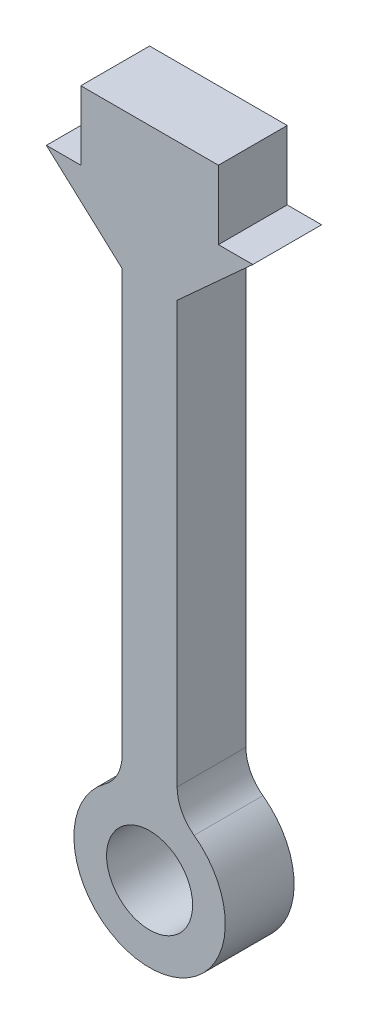
ISO-10303-21;
HEADER;
FILE_DESCRIPTION(('STEP AP214'),'2;1');
FILE_NAME('part.step','',(''),(''),'','','');
FILE_SCHEMA(('AUTOMOTIVE_DESIGN { 1 0 10303 214 1 1 1 1 }'));
ENDSEC;
DATA;
#1=APPLICATION_CONTEXT('core data for automotive mechanical design processes');
#2=APPLICATION_PROTOCOL_DEFINITION('international standard','automotive_design',2000,#1);
#3=PRODUCT_CONTEXT('',#1,'mechanical');
#4=PRODUCT('Part','Part','',(#3));
#5=PRODUCT_RELATED_PRODUCT_CATEGORY('part','',(#4));
#6=PRODUCT_DEFINITION_FORMATION('','',#4);
#7=PRODUCT_DEFINITION_CONTEXT('part definition',#1,'design');
#8=PRODUCT_DEFINITION('design','',#6,#7);
#9=PRODUCT_DEFINITION_SHAPE('','',#8);
#10=(LENGTH_UNIT() NAMED_UNIT(*) SI_UNIT(.MILLI.,.METRE.));
#11=(NAMED_UNIT(*) PLANE_ANGLE_UNIT() SI_UNIT($,.RADIAN.));
#12=(NAMED_UNIT(*) SI_UNIT($,.STERADIAN.) SOLID_ANGLE_UNIT());
#13=UNCERTAINTY_MEASURE_WITH_UNIT(LENGTH_MEASURE(1.E-05),#10,'distance_accuracy_value','');
#14=(GEOMETRIC_REPRESENTATION_CONTEXT(3) GLOBAL_UNCERTAINTY_ASSIGNED_CONTEXT((#13)) GLOBAL_UNIT_ASSIGNED_CONTEXT((#10,
#11,#12)) REPRESENTATION_CONTEXT('',''));
#15=CARTESIAN_POINT('',(0.,0.,0.));
#16=DIRECTION('',(0.,0.,1.));
#17=DIRECTION('',(1.,0.,0.));
#18=AXIS2_PLACEMENT_3D('',#15,#16,#17);
#19=CARTESIAN_POINT('',(0.598395721925135,0.,2.));
#20=DIRECTION('',(1.,0.,0.));
#21=DIRECTION('',(0.,1.,0.));
#22=AXIS2_PLACEMENT_3D('',#19,#20,#21);
#23=PLANE('',#22);
#24=DIRECTION('',(0.,-1.,0.));
#25=VECTOR('',#24,1.);
#26=CARTESIAN_POINT('',(0.598395721925135,0.,0.));
#27=LINE('',#26,#25);
#28=CARTESIAN_POINT('',(0.598395721925135,-3.37226432808586,0.));
#29=VERTEX_POINT('',#28);
#30=CARTESIAN_POINT('',(0.598395721925137,-15.6227189111124,0.));
#31=VERTEX_POINT('',#30);
#32=EDGE_CURVE('E172',#29,#31,#27,.T.);
#33=ORIENTED_EDGE('',*,*,#32,.T.);
#34=DIRECTION('',(0.,0.,1.));
#35=VECTOR('',#34,1.);
#36=CARTESIAN_POINT('',(0.598395721925137,-15.6227189111124,2.));
#37=LINE('',#36,#35);
#38=CARTESIAN_POINT('',(0.598395721925137,-15.6227189111124,2.));
#39=VERTEX_POINT('',#38);
#40=EDGE_CURVE('E214',#31,#39,#37,.T.);
#41=ORIENTED_EDGE('',*,*,#40,.T.);
#42=DIRECTION('',(0.,-1.,0.));
#43=VECTOR('',#42,1.);
#44=CARTESIAN_POINT('',(0.598395721925135,0.,2.));
#45=LINE('',#44,#43);
#46=CARTESIAN_POINT('',(0.598395721925135,-3.37226432808586,2.));
#47=VERTEX_POINT('',#46);
#48=EDGE_CURVE('E152',#47,#39,#45,.T.);
#49=ORIENTED_EDGE('',*,*,#48,.F.);
#50=DIRECTION('',(0.,0.,-1.));
#51=VECTOR('',#50,1.);
#52=CARTESIAN_POINT('',(0.598395721925135,-3.37226432808586,2.));
#53=LINE('',#52,#51);
#54=EDGE_CURVE('E168',#47,#29,#53,.T.);
#55=ORIENTED_EDGE('',*,*,#54,.T.);
#56=EDGE_LOOP('',(#33,#41,#49,#55));
#57=FACE_BOUND('',#56,.T.);
#58=ADVANCED_FACE('F41',(#57),#23,.F.);
#59=CARTESIAN_POINT('',(1.39839572192514,-18.3722643280859,2.));
#60=DIRECTION('',(0.,0.,-1.));
#61=DIRECTION('',(-1.,0.,0.));
#62=AXIS2_PLACEMENT_3D('',#59,#60,#61);
#63=CYLINDRICAL_SURFACE('',#62,2.2);
#64=CARTESIAN_POINT('',(1.39839572192514,-18.3722643280859,2.));
#65=DIRECTION('',(0.,0.,1.));
#66=DIRECTION('',(1.,0.,0.));
#67=AXIS2_PLACEMENT_3D('',#64,#65,#66);
#68=CIRCLE('',#67,2.2);
#69=CARTESIAN_POINT('',(0.104278074866312,-16.5931467053383,2.));
#70=VERTEX_POINT('',#69);
#71=CARTESIAN_POINT('',(2.69251336898396,-16.5931467053383,2.));
#72=VERTEX_POINT('',#71);
#73=EDGE_CURVE('E150',#70,#72,#68,.T.);
#74=ORIENTED_EDGE('',*,*,#73,.F.);
#75=DIRECTION('',(0.,0.,-1.));
#76=VECTOR('',#75,1.);
#77=CARTESIAN_POINT('',(0.104278074866313,-16.5931467053383,2.));
#78=LINE('',#77,#76);
#79=CARTESIAN_POINT('',(0.104278074866312,-16.5931467053383,0.));
#80=VERTEX_POINT('',#79);
#81=EDGE_CURVE('E211',#70,#80,#78,.T.);
#82=ORIENTED_EDGE('',*,*,#81,.T.);
#83=CARTESIAN_POINT('',(1.39839572192514,-18.3722643280859,0.));
#84=DIRECTION('',(0.,0.,1.));
#85=DIRECTION('',(1.,0.,0.));
#86=AXIS2_PLACEMENT_3D('',#83,#84,#85);
#87=CIRCLE('',#86,2.2);
#88=CARTESIAN_POINT('',(2.69251336898396,-16.5931467053383,0.));
#89=VERTEX_POINT('',#88);
#90=EDGE_CURVE('E175',#80,#89,#87,.T.);
#91=ORIENTED_EDGE('',*,*,#90,.T.);
#92=DIRECTION('',(0.,0.,-1.));
#93=VECTOR('',#92,1.);
#94=CARTESIAN_POINT('',(2.69251336898396,-16.5931467053383,2.));
#95=LINE('',#94,#93);
#96=EDGE_CURVE('E138',#89,#72,#95,.F.);
#97=ORIENTED_EDGE('',*,*,#96,.T.);
#98=EDGE_LOOP('',(#74,#82,#91,#97));
#99=FACE_BOUND('',#98,.T.);
#100=ADVANCED_FACE('F227',(#99),#63,.T.);
#101=CARTESIAN_POINT('',(2.19839572192513,0.,2.));
#102=DIRECTION('',(1.,0.,0.));
#103=DIRECTION('',(0.,1.,0.));
#104=AXIS2_PLACEMENT_3D('',#101,#102,#103);
#105=PLANE('',#104);
#106=DIRECTION('',(0.,-1.,0.));
#107=VECTOR('',#106,1.);
#108=CARTESIAN_POINT('',(2.19839572192513,0.,2.));
#109=LINE('',#108,#107);
#110=CARTESIAN_POINT('',(2.19839572192513,-3.37226432808586,2.));
#111=VERTEX_POINT('',#110);
#112=CARTESIAN_POINT('',(2.19839572192514,-15.6227189111124,2.));
#113=VERTEX_POINT('',#112);
#114=EDGE_CURVE('E132',#111,#113,#109,.T.);
#115=ORIENTED_EDGE('',*,*,#114,.T.);
#116=DIRECTION('',(0.,0.,-1.));
#117=VECTOR('',#116,1.);
#118=CARTESIAN_POINT('',(2.19839572192514,-15.6227189111124,2.));
#119=LINE('',#118,#117);
#120=CARTESIAN_POINT('',(2.19839572192514,-15.6227189111124,0.));
#121=VERTEX_POINT('',#120);
#122=EDGE_CURVE('E216',#113,#121,#119,.T.);
#123=ORIENTED_EDGE('',*,*,#122,.T.);
#124=DIRECTION('',(0.,-1.,0.));
#125=VECTOR('',#124,1.);
#126=CARTESIAN_POINT('',(2.19839572192513,0.,0.));
#127=LINE('',#126,#125);
#128=CARTESIAN_POINT('',(2.19839572192513,-3.37226432808586,0.));
#129=VERTEX_POINT('',#128);
#130=EDGE_CURVE('E134',#129,#121,#127,.T.);
#131=ORIENTED_EDGE('',*,*,#130,.F.);
#132=DIRECTION('',(0.,0.,-1.));
#133=VECTOR('',#132,1.);
#134=CARTESIAN_POINT('',(2.19839572192513,-3.37226432808586,2.));
#135=LINE('',#134,#133);
#136=EDGE_CURVE('E129',#111,#129,#135,.T.);
#137=ORIENTED_EDGE('',*,*,#136,.F.);
#138=EDGE_LOOP('',(#115,#123,#131,#137));
#139=FACE_BOUND('',#138,.T.);
#140=ADVANCED_FACE('F131',(#139),#105,.T.);
#141=CARTESIAN_POINT('',(2.6732518021808,-2.94057698239889,2.));
#142=DIRECTION('',(-0.672672793996312,0.739940073395944,0.));
#143=DIRECTION('',(-0.739940073395944,-0.672672793996313,0.));
#144=AXIS2_PLACEMENT_3D('',#141,#142,#143);
#145=PLANE('',#144);
#146=DIRECTION('',(0.739940073395944,0.672672793996313,0.));
#147=VECTOR('',#146,1.);
#148=CARTESIAN_POINT('',(2.6732518021808,-2.94057698239889,0.));
#149=LINE('',#148,#147);
#150=CARTESIAN_POINT('',(4.39839572192513,-1.37226432808586,0.));
#151=VERTEX_POINT('',#150);
#152=EDGE_CURVE('E179',#129,#151,#149,.T.);
#153=ORIENTED_EDGE('',*,*,#152,.T.);
#154=DIRECTION('',(0.,0.,-1.));
#155=VECTOR('',#154,1.);
#156=CARTESIAN_POINT('',(4.39839572192513,-1.37226432808586,2.));
#157=LINE('',#156,#155);
#158=CARTESIAN_POINT('',(4.39839572192513,-1.37226432808586,2.));
#159=VERTEX_POINT('',#158);
#160=EDGE_CURVE('E139',#159,#151,#157,.T.);
#161=ORIENTED_EDGE('',*,*,#160,.F.);
#162=DIRECTION('',(0.739940073395944,0.672672793996313,0.));
#163=VECTOR('',#162,1.);
#164=CARTESIAN_POINT('',(2.6732518021808,-2.94057698239889,2.));
#165=LINE('',#164,#163);
#166=EDGE_CURVE('E142',#111,#159,#165,.T.);
#167=ORIENTED_EDGE('',*,*,#166,.F.);
#168=ORIENTED_EDGE('',*,*,#136,.T.);
#169=EDGE_LOOP('',(#153,#161,#167,#168));
#170=FACE_BOUND('',#169,.T.);
#171=ADVANCED_FACE('F143',(#170),#145,.F.);
#172=CARTESIAN_POINT('',(0.,-1.37226432808586,2.));
#173=DIRECTION('',(0.,1.,0.));
#174=DIRECTION('',(-1.,0.,0.));
#175=AXIS2_PLACEMENT_3D('',#172,#173,#174);
#176=PLANE('',#175);
#177=DIRECTION('',(1.,0.,0.));
#178=VECTOR('',#177,1.);
#179=CARTESIAN_POINT('',(0.,-1.37226432808586,0.));
#180=LINE('',#179,#178);
#181=CARTESIAN_POINT('',(3.39839572192514,-1.37226432808586,0.));
#182=VERTEX_POINT('',#181);
#183=EDGE_CURVE('E181',#182,#151,#180,.T.);
#184=ORIENTED_EDGE('',*,*,#183,.F.);
#185=DIRECTION('',(0.,0.,-1.));
#186=VECTOR('',#185,1.);
#187=CARTESIAN_POINT('',(3.39839572192514,-1.37226432808586,2.));
#188=LINE('',#187,#186);
#189=CARTESIAN_POINT('',(3.39839572192514,-1.37226432808586,2.));
#190=VERTEX_POINT('',#189);
#191=EDGE_CURVE('E207',#190,#182,#188,.T.);
#192=ORIENTED_EDGE('',*,*,#191,.F.);
#193=DIRECTION('',(1.,0.,0.));
#194=VECTOR('',#193,1.);
#195=CARTESIAN_POINT('',(0.,-1.37226432808586,2.));
#196=LINE('',#195,#194);
#197=EDGE_CURVE('E146',#190,#159,#196,.T.);
#198=ORIENTED_EDGE('',*,*,#197,.T.);
#199=ORIENTED_EDGE('',*,*,#160,.T.);
#200=EDGE_LOOP('',(#184,#192,#198,#199));
#201=FACE_BOUND('',#200,.T.);
#202=ADVANCED_FACE('F258',(#201),#176,.T.);
#203=CARTESIAN_POINT('',(3.39839572192514,0.,2.));
#204=DIRECTION('',(-1.,0.,0.));
#205=DIRECTION('',(0.,-1.,0.));
#206=AXIS2_PLACEMENT_3D('',#203,#204,#205);
#207=PLANE('',#206);
#208=DIRECTION('',(0.,1.,0.));
#209=VECTOR('',#208,1.);
#210=CARTESIAN_POINT('',(3.39839572192514,0.,0.));
#211=LINE('',#210,#209);
#212=CARTESIAN_POINT('',(3.39839572192513,0.627735671914142,0.));
#213=VERTEX_POINT('',#212);
#214=EDGE_CURVE('E184',#182,#213,#211,.T.);
#215=ORIENTED_EDGE('',*,*,#214,.T.);
#216=DIRECTION('',(0.,0.,-1.));
#217=VECTOR('',#216,1.);
#218=CARTESIAN_POINT('',(3.39839572192513,0.627735671914142,2.));
#219=LINE('',#218,#217);
#220=CARTESIAN_POINT('',(3.39839572192513,0.627735671914142,2.));
#221=VERTEX_POINT('',#220);
#222=EDGE_CURVE('E205',#221,#213,#219,.T.);
#223=ORIENTED_EDGE('',*,*,#222,.F.);
#224=DIRECTION('',(0.,1.,0.));
#225=VECTOR('',#224,1.);
#226=CARTESIAN_POINT('',(3.39839572192514,0.,2.));
#227=LINE('',#226,#225);
#228=EDGE_CURVE('E157',#190,#221,#227,.T.);
#229=ORIENTED_EDGE('',*,*,#228,.F.);
#230=ORIENTED_EDGE('',*,*,#191,.T.);
#231=EDGE_LOOP('',(#215,#223,#229,#230));
#232=FACE_BOUND('',#231,.T.);
#233=ADVANCED_FACE('F278',(#232),#207,.F.);
#234=CARTESIAN_POINT('',(0.,0.627735671914142,2.));
#235=DIRECTION('',(0.,1.,0.));
#236=DIRECTION('',(-1.,0.,0.));
#237=AXIS2_PLACEMENT_3D('',#234,#235,#236);
#238=PLANE('',#237);
#239=DIRECTION('',(1.,0.,0.));
#240=VECTOR('',#239,1.);
#241=CARTESIAN_POINT('',(0.,0.627735671914142,0.));
#242=LINE('',#241,#240);
#243=CARTESIAN_POINT('',(-0.601604278074866,0.627735671914141,0.));
#244=VERTEX_POINT('',#243);
#245=EDGE_CURVE('E188',#244,#213,#242,.T.);
#246=ORIENTED_EDGE('',*,*,#245,.F.);
#247=DIRECTION('',(0.,0.,-1.));
#248=VECTOR('',#247,1.);
#249=CARTESIAN_POINT('',(-0.601604278074866,0.627735671914141,2.));
#250=LINE('',#249,#248);
#251=CARTESIAN_POINT('',(-0.601604278074866,0.627735671914141,2.));
#252=VERTEX_POINT('',#251);
#253=EDGE_CURVE('E203',#252,#244,#250,.T.);
#254=ORIENTED_EDGE('',*,*,#253,.F.);
#255=DIRECTION('',(1.,0.,0.));
#256=VECTOR('',#255,1.);
#257=CARTESIAN_POINT('',(0.,0.627735671914142,2.));
#258=LINE('',#257,#256);
#259=EDGE_CURVE('E160',#252,#221,#258,.T.);
#260=ORIENTED_EDGE('',*,*,#259,.T.);
#261=ORIENTED_EDGE('',*,*,#222,.T.);
#262=EDGE_LOOP('',(#246,#254,#260,#261));
#263=FACE_BOUND('',#262,.T.);
#264=ADVANCED_FACE('F274',(#263),#238,.T.);
#265=CARTESIAN_POINT('',(-0.601604278074866,0.,2.));
#266=DIRECTION('',(-1.,0.,0.));
#267=DIRECTION('',(0.,0.,1.));
#268=AXIS2_PLACEMENT_3D('',#265,#266,#267);
#269=PLANE('',#268);
#270=DIRECTION('',(0.,1.,0.));
#271=VECTOR('',#270,1.);
#272=CARTESIAN_POINT('',(-0.601604278074866,0.,0.));
#273=LINE('',#272,#271);
#274=CARTESIAN_POINT('',(-0.601604278074866,-1.37226432808586,0.));
#275=VERTEX_POINT('',#274);
#276=EDGE_CURVE('E191',#275,#244,#273,.T.);
#277=ORIENTED_EDGE('',*,*,#276,.F.);
#278=DIRECTION('',(0.,0.,-1.));
#279=VECTOR('',#278,1.);
#280=CARTESIAN_POINT('',(-0.601604278074866,-1.37226432808586,2.));
#281=LINE('',#280,#279);
#282=CARTESIAN_POINT('',(-0.601604278074866,-1.37226432808586,2.));
#283=VERTEX_POINT('',#282);
#284=EDGE_CURVE('E201',#283,#275,#281,.T.);
#285=ORIENTED_EDGE('',*,*,#284,.F.);
#286=DIRECTION('',(0.,1.,0.));
#287=VECTOR('',#286,1.);
#288=CARTESIAN_POINT('',(-0.601604278074866,0.,2.));
#289=LINE('',#288,#287);
#290=EDGE_CURVE('E163',#283,#252,#289,.T.);
#291=ORIENTED_EDGE('',*,*,#290,.T.);
#292=ORIENTED_EDGE('',*,*,#253,.T.);
#293=EDGE_LOOP('',(#277,#285,#291,#292));
#294=FACE_BOUND('',#293,.T.);
#295=ADVANCED_FACE('F255',(#294),#269,.T.);
#296=CARTESIAN_POINT('',(-1.60160427807487,-1.37226432808586,0.));
#297=VERTEX_POINT('',#296);
#298=EDGE_CURVE('E185',#297,#275,#180,.T.);
#299=ORIENTED_EDGE('',*,*,#298,.F.);
#300=DIRECTION('',(0.,0.,-1.));
#301=VECTOR('',#300,1.);
#302=CARTESIAN_POINT('',(-1.60160427807487,-1.37226432808586,2.));
#303=LINE('',#302,#301);
#304=CARTESIAN_POINT('',(-1.60160427807487,-1.37226432808586,2.));
#305=VERTEX_POINT('',#304);
#306=EDGE_CURVE('E199',#305,#297,#303,.T.);
#307=ORIENTED_EDGE('',*,*,#306,.F.);
#308=EDGE_CURVE('E158',#305,#283,#196,.T.);
#309=ORIENTED_EDGE('',*,*,#308,.T.);
#310=ORIENTED_EDGE('',*,*,#284,.T.);
#311=EDGE_LOOP('',(#299,#307,#309,#310));
#312=FACE_BOUND('',#311,.T.);
#313=ADVANCED_FACE('F248',(#312),#176,.T.);
#314=CARTESIAN_POINT('',(1.39839572192514,-18.3722643280859,2.));
#315=DIRECTION('',(0.,0.,-1.));
#316=DIRECTION('',(-1.,0.,0.));
#317=AXIS2_PLACEMENT_3D('',#314,#315,#316);
#318=CYLINDRICAL_SURFACE('',#317,1.25);
#319=CARTESIAN_POINT('',(1.39839572192514,-18.3722643280859,2.));
#320=DIRECTION('',(0.,0.,1.));
#321=DIRECTION('',(1.,0.,0.));
#322=AXIS2_PLACEMENT_3D('',#319,#320,#321);
#323=CIRCLE('',#322,1.25);
#324=CARTESIAN_POINT('',(2.64839572192514,-18.3722643280859,2.));
#325=VERTEX_POINT('',#324);
#326=EDGE_CURVE('E196',#325,#325,#323,.T.);
#327=ORIENTED_EDGE('',*,*,#326,.T.);
#328=EDGE_LOOP('',(#327));
#329=FACE_BOUND('',#328,.T.);
#330=CARTESIAN_POINT('',(1.39839572192514,-18.3722643280859,0.));
#331=DIRECTION('',(0.,0.,1.));
#332=DIRECTION('',(1.,0.,0.));
#333=AXIS2_PLACEMENT_3D('',#330,#331,#332);
#334=CIRCLE('',#333,1.25);
#335=CARTESIAN_POINT('',(2.64839572192514,-18.3722643280859,0.));
#336=VERTEX_POINT('',#335);
#337=EDGE_CURVE('E169',#336,#336,#334,.T.);
#338=ORIENTED_EDGE('',*,*,#337,.F.);
#339=EDGE_LOOP('',(#338));
#340=FACE_BOUND('',#339,.T.);
#341=ADVANCED_FACE('F245',(#329,#340),#318,.F.);
#342=CARTESIAN_POINT('',(-1.40773531175082,-1.5485088429259,2.));
#343=DIRECTION('',(0.672672793996312,0.739940073395944,0.));
#344=DIRECTION('',(-0.739940073395944,0.672672793996312,0.));
#345=AXIS2_PLACEMENT_3D('',#342,#343,#344);
#346=PLANE('',#345);
#347=DIRECTION('',(0.739940073395944,-0.672672793996312,0.));
#348=VECTOR('',#347,1.);
#349=CARTESIAN_POINT('',(-1.40773531175082,-1.5485088429259,0.));
#350=LINE('',#349,#348);
#351=EDGE_CURVE('E194',#297,#29,#350,.T.);
#352=ORIENTED_EDGE('',*,*,#351,.T.);
#353=ORIENTED_EDGE('',*,*,#54,.F.);
#354=DIRECTION('',(0.739940073395944,-0.672672793996312,0.));
#355=VECTOR('',#354,1.);
#356=CARTESIAN_POINT('',(-1.40773531175082,-1.5485088429259,2.));
#357=LINE('',#356,#355);
#358=EDGE_CURVE('E166',#305,#47,#357,.T.);
#359=ORIENTED_EDGE('',*,*,#358,.F.);
#360=ORIENTED_EDGE('',*,*,#306,.T.);
#361=EDGE_LOOP('',(#352,#353,#359,#360));
#362=FACE_BOUND('',#361,.T.);
#363=ADVANCED_FACE('F247',(#362),#346,.F.);
#364=CARTESIAN_POINT('',(0.,0.,2.));
#365=DIRECTION('',(0.,0.,1.));
#366=DIRECTION('',(1.,0.,0.));
#367=AXIS2_PLACEMENT_3D('',#364,#365,#366);
#368=PLANE('',#367);
#369=ORIENTED_EDGE('',*,*,#326,.F.);
#370=EDGE_LOOP('',(#369));
#371=FACE_BOUND('',#370,.T.);
#372=ORIENTED_EDGE('',*,*,#48,.T.);
#373=CARTESIAN_POINT('',(-0.601604278074863,-15.6227189111124,2.));
#374=DIRECTION('',(0.,0.,1.));
#375=DIRECTION('',(1.,0.,0.));
#376=AXIS2_PLACEMENT_3D('',#373,#374,#375);
#377=CIRCLE('',#376,1.2);
#378=EDGE_CURVE('E220',#39,#70,#377,.F.);
#379=ORIENTED_EDGE('',*,*,#378,.T.);
#380=ORIENTED_EDGE('',*,*,#73,.T.);
#381=CARTESIAN_POINT('',(3.39839572192514,-15.6227189111124,2.));
#382=DIRECTION('',(0.,0.,1.));
#383=DIRECTION('',(1.,0.,0.));
#384=AXIS2_PLACEMENT_3D('',#381,#382,#383);
#385=CIRCLE('',#384,1.2);
#386=EDGE_CURVE('E11',#72,#113,#385,.F.);
#387=ORIENTED_EDGE('',*,*,#386,.T.);
#388=ORIENTED_EDGE('',*,*,#114,.F.);
#389=ORIENTED_EDGE('',*,*,#166,.T.);
#390=ORIENTED_EDGE('',*,*,#197,.F.);
#391=ORIENTED_EDGE('',*,*,#228,.T.);
#392=ORIENTED_EDGE('',*,*,#259,.F.);
#393=ORIENTED_EDGE('',*,*,#290,.F.);
#394=ORIENTED_EDGE('',*,*,#308,.F.);
#395=ORIENTED_EDGE('',*,*,#358,.T.);
#396=EDGE_LOOP('',(#372,#379,#380,#387,#388,#389,#390,#391,#392,#393,#394,#395));
#397=FACE_BOUND('',#396,.T.);
#398=ADVANCED_FACE('F149',(#371,#397),#368,.T.);
#399=CARTESIAN_POINT('',(0.,0.,0.));
#400=DIRECTION('',(0.,0.,1.));
#401=DIRECTION('',(1.,0.,0.));
#402=AXIS2_PLACEMENT_3D('',#399,#400,#401);
#403=PLANE('',#402);
#404=ORIENTED_EDGE('',*,*,#337,.T.);
#405=EDGE_LOOP('',(#404));
#406=FACE_BOUND('',#405,.T.);
#407=ORIENTED_EDGE('',*,*,#32,.F.);
#408=ORIENTED_EDGE('',*,*,#351,.F.);
#409=ORIENTED_EDGE('',*,*,#298,.T.);
#410=ORIENTED_EDGE('',*,*,#276,.T.);
#411=ORIENTED_EDGE('',*,*,#245,.T.);
#412=ORIENTED_EDGE('',*,*,#214,.F.);
#413=ORIENTED_EDGE('',*,*,#183,.T.);
#414=ORIENTED_EDGE('',*,*,#152,.F.);
#415=ORIENTED_EDGE('',*,*,#130,.T.);
#416=CARTESIAN_POINT('',(3.39839572192514,-15.6227189111124,0.));
#417=DIRECTION('',(0.,0.,1.));
#418=DIRECTION('',(1.,0.,0.));
#419=AXIS2_PLACEMENT_3D('',#416,#417,#418);
#420=CIRCLE('',#419,1.2);
#421=EDGE_CURVE('E49',#121,#89,#420,.T.);
#422=ORIENTED_EDGE('',*,*,#421,.T.);
#423=ORIENTED_EDGE('',*,*,#90,.F.);
#424=CARTESIAN_POINT('',(-0.601604278074863,-15.6227189111124,0.));
#425=DIRECTION('',(0.,0.,1.));
#426=DIRECTION('',(1.,0.,0.));
#427=AXIS2_PLACEMENT_3D('',#424,#425,#426);
#428=CIRCLE('',#427,1.2);
#429=EDGE_CURVE('E218',#80,#31,#428,.T.);
#430=ORIENTED_EDGE('',*,*,#429,.T.);
#431=EDGE_LOOP('',(#407,#408,#409,#410,#411,#412,#413,#414,#415,#422,#423,#430));
#432=FACE_BOUND('',#431,.T.);
#433=ADVANCED_FACE('F224',(#406,#432),#403,.F.);
#434=CARTESIAN_POINT('',(-0.601604278074863,-15.6227189111124,2.));
#435=DIRECTION('',(0.,0.,-1.));
#436=DIRECTION('',(-1.,0.,0.));
#437=AXIS2_PLACEMENT_3D('',#434,#435,#436);
#438=CYLINDRICAL_SURFACE('',#437,1.2);
#439=ORIENTED_EDGE('',*,*,#378,.F.);
#440=ORIENTED_EDGE('',*,*,#40,.F.);
#441=ORIENTED_EDGE('',*,*,#429,.F.);
#442=ORIENTED_EDGE('',*,*,#81,.F.);
#443=EDGE_LOOP('',(#439,#440,#441,#442));
#444=FACE_BOUND('',#443,.T.);
#445=ADVANCED_FACE('F230',(#444),#438,.F.);
#446=CARTESIAN_POINT('',(3.39839572192514,-15.6227189111124,2.));
#447=DIRECTION('',(0.,0.,-1.));
#448=DIRECTION('',(-1.,0.,0.));
#449=AXIS2_PLACEMENT_3D('',#446,#447,#448);
#450=CYLINDRICAL_SURFACE('',#449,1.2);
#451=ORIENTED_EDGE('',*,*,#386,.F.);
#452=ORIENTED_EDGE('',*,*,#96,.F.);
#453=ORIENTED_EDGE('',*,*,#421,.F.);
#454=ORIENTED_EDGE('',*,*,#122,.F.);
#455=EDGE_LOOP('',(#451,#452,#453,#454));
#456=FACE_BOUND('',#455,.T.);
#457=ADVANCED_FACE('F43',(#456),#450,.F.);
#458=CLOSED_SHELL('',(#58,#100,#140,#171,#202,#233,#264,#295,#313,#341,#363,#398,#433,#445,#457));
#459=MANIFOLD_SOLID_BREP('B2',#458);
#460=ADVANCED_BREP_SHAPE_REPRESENTATION('',(#18,#459),#14);
#461=SHAPE_DEFINITION_REPRESENTATION(#9,#460);
ENDSEC;
END-ISO-10303-21;
